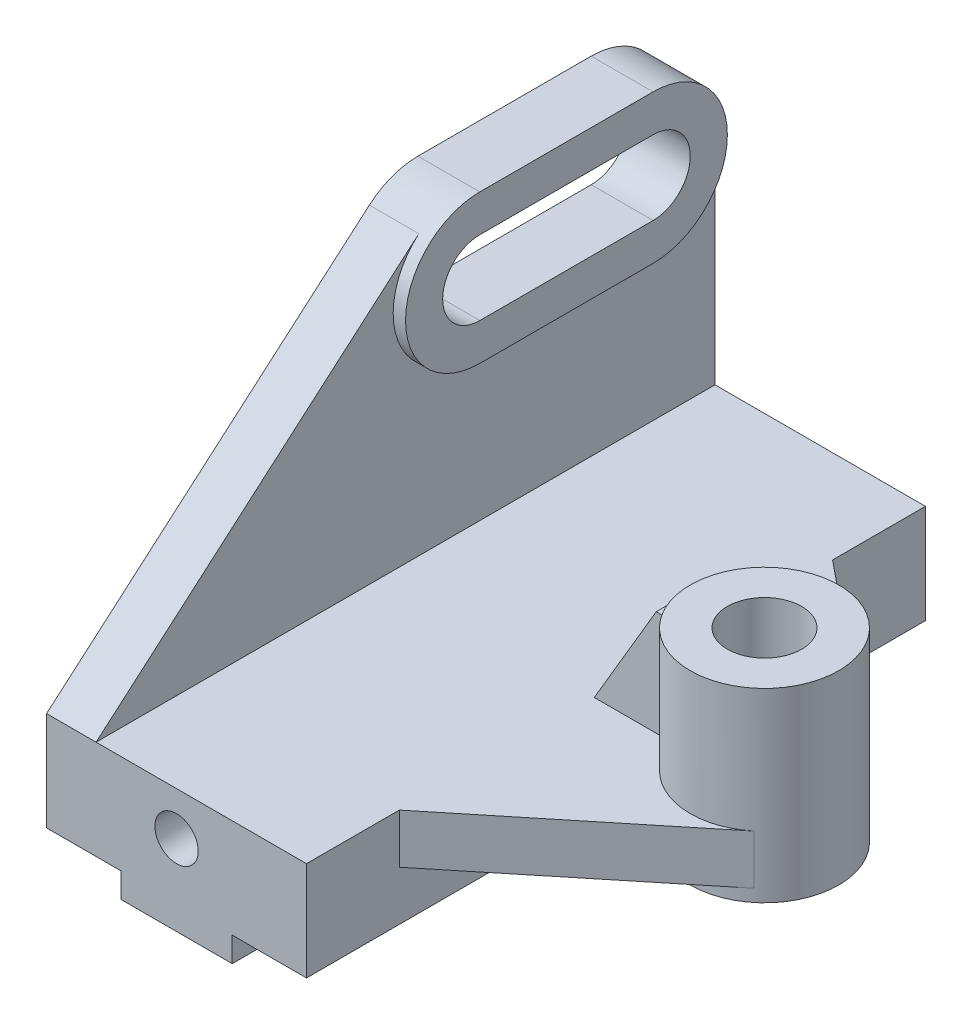
ISO-10303-21;
HEADER;
FILE_DESCRIPTION(('STEP AP214'),'2;1');
FILE_NAME('part.step','',(''),(''),'','','');
FILE_SCHEMA(('AUTOMOTIVE_DESIGN { 1 0 10303 214 1 1 1 1 }'));
ENDSEC;
DATA;
#1=APPLICATION_CONTEXT('core data for automotive mechanical design processes');
#2=APPLICATION_PROTOCOL_DEFINITION('international standard','automotive_design',2000,#1);
#3=PRODUCT_CONTEXT('',#1,'mechanical');
#4=PRODUCT('Part','Part','',(#3));
#5=PRODUCT_RELATED_PRODUCT_CATEGORY('part','',(#4));
#6=PRODUCT_DEFINITION_FORMATION('','',#4);
#7=PRODUCT_DEFINITION_CONTEXT('part definition',#1,'design');
#8=PRODUCT_DEFINITION('design','',#6,#7);
#9=PRODUCT_DEFINITION_SHAPE('','',#8);
#10=(LENGTH_UNIT() NAMED_UNIT(*) SI_UNIT(.MILLI.,.METRE.));
#11=(NAMED_UNIT(*) PLANE_ANGLE_UNIT() SI_UNIT($,.RADIAN.));
#12=(NAMED_UNIT(*) SI_UNIT($,.STERADIAN.) SOLID_ANGLE_UNIT());
#13=UNCERTAINTY_MEASURE_WITH_UNIT(LENGTH_MEASURE(1.E-05),#10,'distance_accuracy_value','');
#14=(GEOMETRIC_REPRESENTATION_CONTEXT(3) GLOBAL_UNCERTAINTY_ASSIGNED_CONTEXT((#13)) GLOBAL_UNIT_ASSIGNED_CONTEXT((#10,
#11,#12)) REPRESENTATION_CONTEXT('',''));
#15=CARTESIAN_POINT('',(0.,0.,0.));
#16=DIRECTION('',(0.,0.,1.));
#17=DIRECTION('',(1.,0.,0.));
#18=AXIS2_PLACEMENT_3D('',#15,#16,#17);
#19=CARTESIAN_POINT('',(42.,-6.,0.));
#20=DIRECTION('',(0.,1.,0.));
#21=DIRECTION('',(0.,0.,1.));
#22=AXIS2_PLACEMENT_3D('',#19,#20,#21);
#23=PLANE('',#22);
#24=DIRECTION('',(0.,0.,-1.));
#25=VECTOR('',#24,1.);
#26=CARTESIAN_POINT('',(12.,-6.,0.));
#27=LINE('',#26,#25);
#28=CARTESIAN_POINT('',(12.,-6.,50.));
#29=VERTEX_POINT('',#28);
#30=CARTESIAN_POINT('',(12.,-6.,-50.));
#31=VERTEX_POINT('',#30);
#32=EDGE_CURVE('E347',#29,#31,#27,.T.);
#33=ORIENTED_EDGE('',*,*,#32,.F.);
#34=DIRECTION('',(-1.,0.,0.));
#35=VECTOR('',#34,1.);
#36=CARTESIAN_POINT('',(42.,-6.,50.));
#37=LINE('',#36,#35);
#38=CARTESIAN_POINT('',(0.,-6.,50.));
#39=VERTEX_POINT('',#38);
#40=EDGE_CURVE('E391',#29,#39,#37,.T.);
#41=ORIENTED_EDGE('',*,*,#40,.T.);
#42=DIRECTION('',(0.,0.,-1.));
#43=VECTOR('',#42,1.);
#44=CARTESIAN_POINT('',(0.,-6.,0.));
#45=LINE('',#44,#43);
#46=CARTESIAN_POINT('',(0.,-6.,-50.));
#47=VERTEX_POINT('',#46);
#48=EDGE_CURVE('E369',#39,#47,#45,.T.);
#49=ORIENTED_EDGE('',*,*,#48,.T.);
#50=DIRECTION('',(-1.,0.,0.));
#51=VECTOR('',#50,1.);
#52=CARTESIAN_POINT('',(42.,-6.,-50.));
#53=LINE('',#52,#51);
#54=EDGE_CURVE('E380',#31,#47,#53,.T.);
#55=ORIENTED_EDGE('',*,*,#54,.F.);
#56=EDGE_LOOP('',(#33,#41,#49,#55));
#57=FACE_BOUND('',#56,.T.);
#58=ADVANCED_FACE('F43',(#57),#23,.F.);
#59=CARTESIAN_POINT('',(8.,30.460450971686,26.3286972259975));
#60=DIRECTION('',(0.,0.75655333037324,0.653931998223944));
#61=DIRECTION('',(0.,-0.653931998223944,0.75655333037324));
#62=AXIS2_PLACEMENT_3D('',#59,#60,#61);
#63=PLANE('',#62);
#64=DIRECTION('',(0.,0.653931998223944,-0.75655333037324));
#65=VECTOR('',#64,1.);
#66=CARTESIAN_POINT('',(0.,30.460450971686,26.3286972259975));
#67=LINE('',#66,#65);
#68=CARTESIAN_POINT('',(0.,10.,50.));
#69=VERTEX_POINT('',#68);
#70=CARTESIAN_POINT('',(0.,55.0786399644789,-2.15281602131265));
#71=VERTEX_POINT('',#70);
#72=EDGE_CURVE('E474',#69,#71,#67,.T.);
#73=ORIENTED_EDGE('',*,*,#72,.F.);
#74=DIRECTION('',(-1.,0.,0.));
#75=VECTOR('',#74,1.);
#76=CARTESIAN_POINT('',(8.,10.,50.));
#77=LINE('',#76,#75);
#78=CARTESIAN_POINT('',(8.00000000000001,10.,50.));
#79=VERTEX_POINT('',#78);
#80=EDGE_CURVE('E516',#79,#69,#77,.T.);
#81=ORIENTED_EDGE('',*,*,#80,.F.);
#82=DIRECTION('',(0.,0.653931998223944,-0.75655333037324));
#83=VECTOR('',#82,1.);
#84=CARTESIAN_POINT('',(8.,30.460450971686,26.3286972259975));
#85=LINE('',#84,#83);
#86=CARTESIAN_POINT('',(8.,55.0786399644789,-2.15281602131263));
#87=VERTEX_POINT('',#86);
#88=EDGE_CURVE('E495',#79,#87,#85,.T.);
#89=ORIENTED_EDGE('',*,*,#88,.T.);
#90=DIRECTION('',(-1.,0.,0.));
#91=VECTOR('',#90,1.);
#92=CARTESIAN_POINT('',(8.,55.0786399644789,-2.15281602131265));
#93=LINE('',#92,#91);
#94=EDGE_CURVE('E52',#87,#71,#93,.T.);
#95=ORIENTED_EDGE('',*,*,#94,.T.);
#96=EDGE_LOOP('',(#73,#81,#89,#95));
#97=FACE_BOUND('',#96,.T.);
#98=ADVANCED_FACE('F45',(#97),#63,.T.);
#99=CARTESIAN_POINT('',(8.,0.,-50.));
#100=DIRECTION('',(0.,0.,-1.));
#101=DIRECTION('',(0.,1.,0.));
#102=AXIS2_PLACEMENT_3D('',#99,#100,#101);
#103=PLANE('',#102);
#104=CARTESIAN_POINT('',(21.,3.,-50.));
#105=DIRECTION('',(0.,0.,1.));
#106=DIRECTION('',(1.,0.,0.));
#107=AXIS2_PLACEMENT_3D('',#104,#105,#106);
#108=CIRCLE('',#107,3.5);
#109=CARTESIAN_POINT('',(24.5,3.,-50.));
#110=VERTEX_POINT('',#109);
#111=EDGE_CURVE('E320',#110,#110,#108,.T.);
#112=ORIENTED_EDGE('',*,*,#111,.T.);
#113=EDGE_LOOP('',(#112));
#114=FACE_BOUND('',#113,.T.);
#115=DIRECTION('',(0.,-1.,0.));
#116=VECTOR('',#115,1.);
#117=CARTESIAN_POINT('',(0.,0.,-50.));
#118=LINE('',#117,#116);
#119=CARTESIAN_POINT('',(0.,46.,-50.));
#120=VERTEX_POINT('',#119);
#121=EDGE_CURVE('E489',#120,#47,#118,.T.);
#122=ORIENTED_EDGE('',*,*,#121,.F.);
#123=DIRECTION('',(-1.,0.,0.));
#124=VECTOR('',#123,1.);
#125=CARTESIAN_POINT('',(8.,46.,-50.));
#126=LINE('',#125,#124);
#127=CARTESIAN_POINT('',(8.,46.,-50.));
#128=VERTEX_POINT('',#127);
#129=EDGE_CURVE('E507',#128,#120,#126,.T.);
#130=ORIENTED_EDGE('',*,*,#129,.F.);
#131=DIRECTION('',(0.,-1.,0.));
#132=VECTOR('',#131,1.);
#133=CARTESIAN_POINT('',(8.,0.,-50.));
#134=LINE('',#133,#132);
#135=CARTESIAN_POINT('',(8.,10.,-50.));
#136=VERTEX_POINT('',#135);
#137=EDGE_CURVE('E503',#128,#136,#134,.T.);
#138=ORIENTED_EDGE('',*,*,#137,.T.);
#139=DIRECTION('',(-1.,0.,0.));
#140=VECTOR('',#139,1.);
#141=CARTESIAN_POINT('',(42.,10.,-50.));
#142=LINE('',#141,#140);
#143=CARTESIAN_POINT('',(42.,10.,-50.));
#144=VERTEX_POINT('',#143);
#145=EDGE_CURVE('E400',#144,#136,#142,.T.);
#146=ORIENTED_EDGE('',*,*,#145,.F.);
#147=DIRECTION('',(0.,-1.,0.));
#148=VECTOR('',#147,1.);
#149=CARTESIAN_POINT('',(42.,0.,-50.));
#150=LINE('',#149,#148);
#151=CARTESIAN_POINT('',(42.,-6.,-50.));
#152=VERTEX_POINT('',#151);
#153=EDGE_CURVE('E364',#144,#152,#150,.T.);
#154=ORIENTED_EDGE('',*,*,#153,.T.);
#155=CARTESIAN_POINT('',(30.,-6.,-50.));
#156=VERTEX_POINT('',#155);
#157=EDGE_CURVE('E387',#152,#156,#53,.T.);
#158=ORIENTED_EDGE('',*,*,#157,.T.);
#159=DIRECTION('',(0.,-1.,0.));
#160=VECTOR('',#159,1.);
#161=CARTESIAN_POINT('',(30.,0.,-50.));
#162=LINE('',#161,#160);
#163=CARTESIAN_POINT('',(30.,-10.,-50.));
#164=VERTEX_POINT('',#163);
#165=EDGE_CURVE('E328',#156,#164,#162,.T.);
#166=ORIENTED_EDGE('',*,*,#165,.T.);
#167=DIRECTION('',(-1.,0.,0.));
#168=VECTOR('',#167,1.);
#169=CARTESIAN_POINT('',(30.,-10.,-50.));
#170=LINE('',#169,#168);
#171=CARTESIAN_POINT('',(12.,-10.,-50.));
#172=VERTEX_POINT('',#171);
#173=EDGE_CURVE('E343',#164,#172,#170,.T.);
#174=ORIENTED_EDGE('',*,*,#173,.T.);
#175=DIRECTION('',(0.,-1.,0.));
#176=VECTOR('',#175,1.);
#177=CARTESIAN_POINT('',(12.,0.,-50.));
#178=LINE('',#177,#176);
#179=EDGE_CURVE('E324',#31,#172,#178,.T.);
#180=ORIENTED_EDGE('',*,*,#179,.F.);
#181=ORIENTED_EDGE('',*,*,#54,.T.);
#182=EDGE_LOOP('',(#122,#130,#138,#146,#154,#158,#166,#174,#180,#181));
#183=FACE_BOUND('',#182,.T.);
#184=ADVANCED_FACE('F561',(#114,#183),#103,.T.);
#185=CARTESIAN_POINT('',(8.,0.,0.));
#186=DIRECTION('',(1.,0.,0.));
#187=DIRECTION('',(0.,0.,-1.));
#188=AXIS2_PLACEMENT_3D('',#185,#186,#187);
#189=PLANE('',#188);
#190=CARTESIAN_POINT('',(8.,46.,-38.));
#191=DIRECTION('',(1.,0.,0.));
#192=DIRECTION('',(0.,0.,-1.));
#193=AXIS2_PLACEMENT_3D('',#190,#191,#192);
#194=CIRCLE('',#193,12.);
#195=CARTESIAN_POINT('',(8.,34.,-38.));
#196=VERTEX_POINT('',#195);
#197=EDGE_CURVE('E485',#196,#128,#194,.T.);
#198=ORIENTED_EDGE('',*,*,#197,.F.);
#199=DIRECTION('',(0.,0.,-1.));
#200=VECTOR('',#199,1.);
#201=CARTESIAN_POINT('',(8.,34.,0.));
#202=LINE('',#201,#200);
#203=CARTESIAN_POINT('',(8.,34.,-9.99999999999998));
#204=VERTEX_POINT('',#203);
#205=EDGE_CURVE('E488',#204,#196,#202,.T.);
#206=ORIENTED_EDGE('',*,*,#205,.F.);
#207=CARTESIAN_POINT('',(8.,46.,-9.99999999999998));
#208=DIRECTION('',(1.,0.,0.));
#209=DIRECTION('',(0.,0.,-1.));
#210=AXIS2_PLACEMENT_3D('',#207,#208,#209);
#211=CIRCLE('',#210,12.);
#212=EDGE_CURVE('E492',#87,#204,#211,.T.);
#213=ORIENTED_EDGE('',*,*,#212,.F.);
#214=ORIENTED_EDGE('',*,*,#88,.F.);
#215=DIRECTION('',(0.,0.,-1.));
#216=VECTOR('',#215,1.);
#217=CARTESIAN_POINT('',(8.,10.,0.));
#218=LINE('',#217,#216);
#219=EDGE_CURVE('E499',#79,#136,#218,.T.);
#220=ORIENTED_EDGE('',*,*,#219,.T.);
#221=ORIENTED_EDGE('',*,*,#137,.F.);
#222=EDGE_LOOP('',(#198,#206,#213,#214,#220,#221));
#223=FACE_BOUND('',#222,.T.);
#224=ADVANCED_FACE('F540',(#223),#189,.T.);
#225=CARTESIAN_POINT('',(0.,0.,0.));
#226=DIRECTION('',(1.,0.,0.));
#227=DIRECTION('',(0.,0.,-1.));
#228=AXIS2_PLACEMENT_3D('',#225,#226,#227);
#229=PLANE('',#228);
#230=CARTESIAN_POINT('',(0.,46.,-38.));
#231=DIRECTION('',(1.,0.,0.));
#232=DIRECTION('',(0.,0.,-1.));
#233=AXIS2_PLACEMENT_3D('',#230,#231,#232);
#234=CIRCLE('',#233,12.);
#235=CARTESIAN_POINT('',(0.,58.,-38.));
#236=VERTEX_POINT('',#235);
#237=EDGE_CURVE('E449',#120,#236,#234,.T.);
#238=ORIENTED_EDGE('',*,*,#237,.F.);
#239=ORIENTED_EDGE('',*,*,#121,.T.);
#240=ORIENTED_EDGE('',*,*,#48,.F.);
#241=DIRECTION('',(0.,-1.,0.));
#242=VECTOR('',#241,1.);
#243=CARTESIAN_POINT('',(0.,0.,50.));
#244=LINE('',#243,#242);
#245=EDGE_CURVE('E363',#69,#39,#244,.T.);
#246=ORIENTED_EDGE('',*,*,#245,.F.);
#247=ORIENTED_EDGE('',*,*,#72,.T.);
#248=CARTESIAN_POINT('',(0.,46.,-9.99999999999998));
#249=DIRECTION('',(1.,0.,0.));
#250=DIRECTION('',(0.,0.,-1.));
#251=AXIS2_PLACEMENT_3D('',#248,#249,#250);
#252=CIRCLE('',#251,12.);
#253=CARTESIAN_POINT('',(0.,58.,-9.99999999999998));
#254=VERTEX_POINT('',#253);
#255=EDGE_CURVE('E409',#254,#71,#252,.T.);
#256=ORIENTED_EDGE('',*,*,#255,.F.);
#257=DIRECTION('',(0.,0.,-1.));
#258=VECTOR('',#257,1.);
#259=CARTESIAN_POINT('',(0.,58.,0.));
#260=LINE('',#259,#258);
#261=EDGE_CURVE('E452',#254,#236,#260,.T.);
#262=ORIENTED_EDGE('',*,*,#261,.T.);
#263=EDGE_LOOP('',(#238,#239,#240,#246,#247,#256,#262));
#264=FACE_BOUND('',#263,.T.);
#265=CARTESIAN_POINT('',(0.,46.,-38.));
#266=DIRECTION('',(1.,0.,0.));
#267=DIRECTION('',(0.,0.,-1.));
#268=AXIS2_PLACEMENT_3D('',#265,#266,#267);
#269=CIRCLE('',#268,6.);
#270=CARTESIAN_POINT('',(0.,40.,-38.));
#271=VERTEX_POINT('',#270);
#272=CARTESIAN_POINT('',(0.,52.,-38.));
#273=VERTEX_POINT('',#272);
#274=EDGE_CURVE('E403',#271,#273,#269,.T.);
#275=ORIENTED_EDGE('',*,*,#274,.T.);
#276=DIRECTION('',(0.,0.,-1.));
#277=VECTOR('',#276,1.);
#278=CARTESIAN_POINT('',(0.,52.,0.));
#279=LINE('',#278,#277);
#280=CARTESIAN_POINT('',(0.,52.,-9.99999999999998));
#281=VERTEX_POINT('',#280);
#282=EDGE_CURVE('E445',#281,#273,#279,.T.);
#283=ORIENTED_EDGE('',*,*,#282,.F.);
#284=CARTESIAN_POINT('',(0.,46.,-9.99999999999998));
#285=DIRECTION('',(1.,0.,0.));
#286=DIRECTION('',(0.,0.,-1.));
#287=AXIS2_PLACEMENT_3D('',#284,#285,#286);
#288=CIRCLE('',#287,6.);
#289=CARTESIAN_POINT('',(0.,40.,-9.99999999999998));
#290=VERTEX_POINT('',#289);
#291=EDGE_CURVE('E441',#281,#290,#288,.T.);
#292=ORIENTED_EDGE('',*,*,#291,.T.);
#293=DIRECTION('',(0.,0.,-1.));
#294=VECTOR('',#293,1.);
#295=CARTESIAN_POINT('',(0.,40.,0.));
#296=LINE('',#295,#294);
#297=EDGE_CURVE('E437',#290,#271,#296,.T.);
#298=ORIENTED_EDGE('',*,*,#297,.T.);
#299=EDGE_LOOP('',(#275,#283,#292,#298));
#300=FACE_BOUND('',#299,.T.);
#301=ADVANCED_FACE('F530',(#264,#300),#229,.F.);
#302=CARTESIAN_POINT('',(10.,46.,-9.99999999999998));
#303=DIRECTION('',(-1.,0.,0.));
#304=DIRECTION('',(0.,0.,1.));
#305=AXIS2_PLACEMENT_3D('',#302,#303,#304);
#306=CYLINDRICAL_SURFACE('',#305,12.);
#307=ORIENTED_EDGE('',*,*,#255,.T.);
#308=ORIENTED_EDGE('',*,*,#94,.F.);
#309=ORIENTED_EDGE('',*,*,#212,.T.);
#310=DIRECTION('',(-1.,0.,0.));
#311=VECTOR('',#310,1.);
#312=CARTESIAN_POINT('',(10.,34.,-9.99999999999998));
#313=LINE('',#312,#311);
#314=CARTESIAN_POINT('',(10.,34.,-9.99999999999998));
#315=VERTEX_POINT('',#314);
#316=EDGE_CURVE('E462',#315,#204,#313,.T.);
#317=ORIENTED_EDGE('',*,*,#316,.F.);
#318=CARTESIAN_POINT('',(10.,46.,-9.99999999999998));
#319=DIRECTION('',(1.,0.,0.));
#320=DIRECTION('',(0.,0.,-1.));
#321=AXIS2_PLACEMENT_3D('',#318,#319,#320);
#322=CIRCLE('',#321,12.);
#323=CARTESIAN_POINT('',(10.,58.,-9.99999999999998));
#324=VERTEX_POINT('',#323);
#325=EDGE_CURVE('E427',#324,#315,#322,.T.);
#326=ORIENTED_EDGE('',*,*,#325,.F.);
#327=DIRECTION('',(-1.,0.,0.));
#328=VECTOR('',#327,1.);
#329=CARTESIAN_POINT('',(10.,58.,-9.99999999999998));
#330=LINE('',#329,#328);
#331=EDGE_CURVE('E467',#324,#254,#330,.T.);
#332=ORIENTED_EDGE('',*,*,#331,.T.);
#333=EDGE_LOOP('',(#307,#308,#309,#317,#326,#332));
#334=FACE_BOUND('',#333,.T.);
#335=ADVANCED_FACE('F544',(#334),#306,.T.);
#336=CARTESIAN_POINT('',(10.,46.,-38.));
#337=DIRECTION('',(-1.,0.,0.));
#338=DIRECTION('',(0.,0.,1.));
#339=AXIS2_PLACEMENT_3D('',#336,#337,#338);
#340=CYLINDRICAL_SURFACE('',#339,12.);
#341=ORIENTED_EDGE('',*,*,#129,.T.);
#342=ORIENTED_EDGE('',*,*,#237,.T.);
#343=DIRECTION('',(-1.,0.,0.));
#344=VECTOR('',#343,1.);
#345=CARTESIAN_POINT('',(10.,58.,-38.));
#346=LINE('',#345,#344);
#347=CARTESIAN_POINT('',(10.,58.,-38.));
#348=VERTEX_POINT('',#347);
#349=EDGE_CURVE('E470',#348,#236,#346,.T.);
#350=ORIENTED_EDGE('',*,*,#349,.F.);
#351=CARTESIAN_POINT('',(10.,46.,-38.));
#352=DIRECTION('',(1.,0.,0.));
#353=DIRECTION('',(0.,0.,-1.));
#354=AXIS2_PLACEMENT_3D('',#351,#352,#353);
#355=CIRCLE('',#354,12.);
#356=CARTESIAN_POINT('',(10.,34.,-38.));
#357=VERTEX_POINT('',#356);
#358=EDGE_CURVE('E420',#357,#348,#355,.T.);
#359=ORIENTED_EDGE('',*,*,#358,.F.);
#360=DIRECTION('',(-1.,0.,0.));
#361=VECTOR('',#360,1.);
#362=CARTESIAN_POINT('',(10.,34.,-38.));
#363=LINE('',#362,#361);
#364=EDGE_CURVE('E458',#357,#196,#363,.T.);
#365=ORIENTED_EDGE('',*,*,#364,.T.);
#366=ORIENTED_EDGE('',*,*,#197,.T.);
#367=EDGE_LOOP('',(#341,#342,#350,#359,#365,#366));
#368=FACE_BOUND('',#367,.T.);
#369=ADVANCED_FACE('F624',(#368),#340,.T.);
#370=CARTESIAN_POINT('',(10.,58.,0.));
#371=DIRECTION('',(0.,1.,0.));
#372=DIRECTION('',(0.,0.,1.));
#373=AXIS2_PLACEMENT_3D('',#370,#371,#372);
#374=PLANE('',#373);
#375=ORIENTED_EDGE('',*,*,#261,.F.);
#376=ORIENTED_EDGE('',*,*,#331,.F.);
#377=DIRECTION('',(0.,0.,-1.));
#378=VECTOR('',#377,1.);
#379=CARTESIAN_POINT('',(10.,58.,0.));
#380=LINE('',#379,#378);
#381=EDGE_CURVE('E423',#324,#348,#380,.T.);
#382=ORIENTED_EDGE('',*,*,#381,.T.);
#383=ORIENTED_EDGE('',*,*,#349,.T.);
#384=EDGE_LOOP('',(#375,#376,#382,#383));
#385=FACE_BOUND('',#384,.T.);
#386=ADVANCED_FACE('F556',(#385),#374,.T.);
#387=CARTESIAN_POINT('',(10.,46.,-38.));
#388=DIRECTION('',(-1.,0.,0.));
#389=DIRECTION('',(0.,0.,1.));
#390=AXIS2_PLACEMENT_3D('',#387,#388,#389);
#391=CYLINDRICAL_SURFACE('',#390,6.);
#392=ORIENTED_EDGE('',*,*,#274,.F.);
#393=DIRECTION('',(-1.,0.,0.));
#394=VECTOR('',#393,1.);
#395=CARTESIAN_POINT('',(10.,40.,-38.));
#396=LINE('',#395,#394);
#397=CARTESIAN_POINT('',(10.,40.,-38.));
#398=VERTEX_POINT('',#397);
#399=EDGE_CURVE('E463',#398,#271,#396,.T.);
#400=ORIENTED_EDGE('',*,*,#399,.F.);
#401=CARTESIAN_POINT('',(10.,46.,-38.));
#402=DIRECTION('',(1.,0.,0.));
#403=DIRECTION('',(0.,0.,-1.));
#404=AXIS2_PLACEMENT_3D('',#401,#402,#403);
#405=CIRCLE('',#404,6.);
#406=CARTESIAN_POINT('',(10.,52.,-38.));
#407=VERTEX_POINT('',#406);
#408=EDGE_CURVE('E404',#398,#407,#405,.T.);
#409=ORIENTED_EDGE('',*,*,#408,.T.);
#410=DIRECTION('',(-1.,0.,0.));
#411=VECTOR('',#410,1.);
#412=CARTESIAN_POINT('',(10.,52.,-38.));
#413=LINE('',#412,#411);
#414=EDGE_CURVE('E433',#407,#273,#413,.T.);
#415=ORIENTED_EDGE('',*,*,#414,.T.);
#416=EDGE_LOOP('',(#392,#400,#409,#415));
#417=FACE_BOUND('',#416,.T.);
#418=ADVANCED_FACE('F631',(#417),#391,.F.);
#419=CARTESIAN_POINT('',(10.,40.,0.));
#420=DIRECTION('',(0.,1.,0.));
#421=DIRECTION('',(0.,0.,1.));
#422=AXIS2_PLACEMENT_3D('',#419,#420,#421);
#423=PLANE('',#422);
#424=ORIENTED_EDGE('',*,*,#297,.F.);
#425=DIRECTION('',(-1.,0.,0.));
#426=VECTOR('',#425,1.);
#427=CARTESIAN_POINT('',(10.,40.,-9.99999999999998));
#428=LINE('',#427,#426);
#429=CARTESIAN_POINT('',(10.,40.,-9.99999999999998));
#430=VERTEX_POINT('',#429);
#431=EDGE_CURVE('E480',#430,#290,#428,.T.);
#432=ORIENTED_EDGE('',*,*,#431,.F.);
#433=DIRECTION('',(0.,0.,-1.));
#434=VECTOR('',#433,1.);
#435=CARTESIAN_POINT('',(10.,40.,0.));
#436=LINE('',#435,#434);
#437=EDGE_CURVE('E408',#430,#398,#436,.T.);
#438=ORIENTED_EDGE('',*,*,#437,.T.);
#439=ORIENTED_EDGE('',*,*,#399,.T.);
#440=EDGE_LOOP('',(#424,#432,#438,#439));
#441=FACE_BOUND('',#440,.T.);
#442=ADVANCED_FACE('F642',(#441),#423,.T.);
#443=CARTESIAN_POINT('',(10.,46.,-9.99999999999998));
#444=DIRECTION('',(-1.,0.,0.));
#445=DIRECTION('',(0.,0.,1.));
#446=AXIS2_PLACEMENT_3D('',#443,#444,#445);
#447=CYLINDRICAL_SURFACE('',#446,6.);
#448=ORIENTED_EDGE('',*,*,#291,.F.);
#449=DIRECTION('',(-1.,0.,0.));
#450=VECTOR('',#449,1.);
#451=CARTESIAN_POINT('',(10.,52.,-9.99999999999998));
#452=LINE('',#451,#450);
#453=CARTESIAN_POINT('',(10.,52.,-9.99999999999998));
#454=VERTEX_POINT('',#453);
#455=EDGE_CURVE('E477',#454,#281,#452,.T.);
#456=ORIENTED_EDGE('',*,*,#455,.F.);
#457=CARTESIAN_POINT('',(10.,46.,-9.99999999999998));
#458=DIRECTION('',(1.,0.,0.));
#459=DIRECTION('',(0.,0.,-1.));
#460=AXIS2_PLACEMENT_3D('',#457,#458,#459);
#461=CIRCLE('',#460,6.);
#462=EDGE_CURVE('E413',#454,#430,#461,.T.);
#463=ORIENTED_EDGE('',*,*,#462,.T.);
#464=ORIENTED_EDGE('',*,*,#431,.T.);
#465=EDGE_LOOP('',(#448,#456,#463,#464));
#466=FACE_BOUND('',#465,.T.);
#467=ADVANCED_FACE('F638',(#466),#447,.F.);
#468=CARTESIAN_POINT('',(10.,52.,0.));
#469=DIRECTION('',(0.,1.,0.));
#470=DIRECTION('',(0.,0.,1.));
#471=AXIS2_PLACEMENT_3D('',#468,#469,#470);
#472=PLANE('',#471);
#473=ORIENTED_EDGE('',*,*,#282,.T.);
#474=ORIENTED_EDGE('',*,*,#414,.F.);
#475=DIRECTION('',(0.,0.,-1.));
#476=VECTOR('',#475,1.);
#477=CARTESIAN_POINT('',(10.,52.,0.));
#478=LINE('',#477,#476);
#479=EDGE_CURVE('E417',#454,#407,#478,.T.);
#480=ORIENTED_EDGE('',*,*,#479,.F.);
#481=ORIENTED_EDGE('',*,*,#455,.T.);
#482=EDGE_LOOP('',(#473,#474,#480,#481));
#483=FACE_BOUND('',#482,.T.);
#484=ADVANCED_FACE('F635',(#483),#472,.F.);
#485=CARTESIAN_POINT('',(10.,34.,0.));
#486=DIRECTION('',(0.,1.,0.));
#487=DIRECTION('',(0.,0.,1.));
#488=AXIS2_PLACEMENT_3D('',#485,#486,#487);
#489=PLANE('',#488);
#490=ORIENTED_EDGE('',*,*,#205,.T.);
#491=ORIENTED_EDGE('',*,*,#364,.F.);
#492=DIRECTION('',(0.,0.,-1.));
#493=VECTOR('',#492,1.);
#494=CARTESIAN_POINT('',(10.,34.,0.));
#495=LINE('',#494,#493);
#496=EDGE_CURVE('E430',#315,#357,#495,.T.);
#497=ORIENTED_EDGE('',*,*,#496,.F.);
#498=ORIENTED_EDGE('',*,*,#316,.T.);
#499=EDGE_LOOP('',(#490,#491,#497,#498));
#500=FACE_BOUND('',#499,.T.);
#501=ADVANCED_FACE('F548',(#500),#489,.F.);
#502=CARTESIAN_POINT('',(10.,0.,0.));
#503=DIRECTION('',(1.,0.,0.));
#504=DIRECTION('',(0.,0.,-1.));
#505=AXIS2_PLACEMENT_3D('',#502,#503,#504);
#506=PLANE('',#505);
#507=ORIENTED_EDGE('',*,*,#408,.F.);
#508=ORIENTED_EDGE('',*,*,#437,.F.);
#509=ORIENTED_EDGE('',*,*,#462,.F.);
#510=ORIENTED_EDGE('',*,*,#479,.T.);
#511=EDGE_LOOP('',(#507,#508,#509,#510));
#512=FACE_BOUND('',#511,.T.);
#513=ORIENTED_EDGE('',*,*,#358,.T.);
#514=ORIENTED_EDGE('',*,*,#381,.F.);
#515=ORIENTED_EDGE('',*,*,#325,.T.);
#516=ORIENTED_EDGE('',*,*,#496,.T.);
#517=EDGE_LOOP('',(#513,#514,#515,#516));
#518=FACE_BOUND('',#517,.T.);
#519=ADVANCED_FACE('F552',(#512,#518),#506,.T.);
#520=CARTESIAN_POINT('',(42.,10.,0.));
#521=DIRECTION('',(0.,1.,0.));
#522=DIRECTION('',(0.,0.,1.));
#523=AXIS2_PLACEMENT_3D('',#520,#521,#522);
#524=PLANE('',#523);
#525=DIRECTION('',(1.,0.,0.));
#526=VECTOR('',#525,1.);
#527=CARTESIAN_POINT('',(42.,10.,3.5));
#528=LINE('',#527,#526);
#529=CARTESIAN_POINT('',(42.,10.,3.5));
#530=VERTEX_POINT('',#529);
#531=CARTESIAN_POINT('',(54.521759716751,10.,3.5));
#532=VERTEX_POINT('',#531);
#533=EDGE_CURVE('E260',#530,#532,#528,.T.);
#534=ORIENTED_EDGE('',*,*,#533,.F.);
#535=DIRECTION('',(0.,0.,-1.));
#536=VECTOR('',#535,1.);
#537=CARTESIAN_POINT('',(42.,10.,0.));
#538=LINE('',#537,#536);
#539=CARTESIAN_POINT('',(42.,10.,-3.5));
#540=VERTEX_POINT('',#539);
#541=EDGE_CURVE('E226',#540,#530,#538,.F.);
#542=ORIENTED_EDGE('',*,*,#541,.F.);
#543=DIRECTION('',(1.,0.,0.));
#544=VECTOR('',#543,1.);
#545=CARTESIAN_POINT('',(42.,10.,-3.5));
#546=LINE('',#545,#544);
#547=CARTESIAN_POINT('',(54.521759716751,10.,-3.5));
#548=VERTEX_POINT('',#547);
#549=EDGE_CURVE('E254',#540,#548,#546,.T.);
#550=ORIENTED_EDGE('',*,*,#549,.T.);
#551=CARTESIAN_POINT('',(66.,10.,0.));
#552=DIRECTION('',(0.,1.,0.));
#553=DIRECTION('',(0.,0.,1.));
#554=AXIS2_PLACEMENT_3D('',#551,#552,#553);
#555=CIRCLE('',#554,12.);
#556=CARTESIAN_POINT('',(73.5739207368795,10.,-9.30783136243166));
#557=VERTEX_POINT('',#556);
#558=EDGE_CURVE('E300',#557,#548,#555,.T.);
#559=ORIENTED_EDGE('',*,*,#558,.F.);
#560=DIRECTION('',(0.775652613535973,0.,0.631160061406626));
#561=VECTOR('',#560,1.);
#562=CARTESIAN_POINT('',(33.8658802624573,10.,-41.6188541409436));
#563=LINE('',#562,#561);
#564=CARTESIAN_POINT('',(42.,10.,-35.));
#565=VERTEX_POINT('',#564);
#566=EDGE_CURVE('E285',#565,#557,#563,.T.);
#567=ORIENTED_EDGE('',*,*,#566,.F.);
#568=DIRECTION('',(0.,0.,-1.));
#569=VECTOR('',#568,1.);
#570=CARTESIAN_POINT('',(42.,10.,0.));
#571=LINE('',#570,#569);
#572=EDGE_CURVE('E368',#565,#144,#571,.T.);
#573=ORIENTED_EDGE('',*,*,#572,.T.);
#574=ORIENTED_EDGE('',*,*,#145,.T.);
#575=ORIENTED_EDGE('',*,*,#219,.F.);
#576=DIRECTION('',(-1.,0.,0.));
#577=VECTOR('',#576,1.);
#578=CARTESIAN_POINT('',(42.,10.,50.));
#579=LINE('',#578,#577);
#580=CARTESIAN_POINT('',(42.,10.,50.));
#581=VERTEX_POINT('',#580);
#582=EDGE_CURVE('E396',#581,#79,#579,.T.);
#583=ORIENTED_EDGE('',*,*,#582,.F.);
#584=CARTESIAN_POINT('',(42.,10.,35.));
#585=VERTEX_POINT('',#584);
#586=EDGE_CURVE('E370',#581,#585,#571,.T.);
#587=ORIENTED_EDGE('',*,*,#586,.T.);
#588=DIRECTION('',(0.775652613535972,0.,-0.631160061406626));
#589=VECTOR('',#588,1.);
#590=CARTESIAN_POINT('',(33.8658802624574,10.,41.6188541409436));
#591=LINE('',#590,#589);
#592=CARTESIAN_POINT('',(73.5739207368795,10.,9.30783136243166));
#593=VERTEX_POINT('',#592);
#594=EDGE_CURVE('E66',#585,#593,#591,.T.);
#595=ORIENTED_EDGE('',*,*,#594,.T.);
#596=EDGE_CURVE('E299',#532,#593,#555,.T.);
#597=ORIENTED_EDGE('',*,*,#596,.F.);
#598=EDGE_LOOP('',(#534,#542,#550,#559,#567,#573,#574,#575,#583,#587,#595,#597));
#599=FACE_BOUND('',#598,.T.);
#600=ADVANCED_FACE('F577',(#599),#524,.T.);
#601=CARTESIAN_POINT('',(42.,0.,50.));
#602=DIRECTION('',(0.,0.,-1.));
#603=DIRECTION('',(-1.,0.,0.));
#604=AXIS2_PLACEMENT_3D('',#601,#602,#603);
#605=PLANE('',#604);
#606=CARTESIAN_POINT('',(21.,3.,50.));
#607=DIRECTION('',(0.,0.,1.));
#608=DIRECTION('',(1.,0.,0.));
#609=AXIS2_PLACEMENT_3D('',#606,#607,#608);
#610=CIRCLE('',#609,3.5);
#611=CARTESIAN_POINT('',(24.5,3.,50.));
#612=VERTEX_POINT('',#611);
#613=EDGE_CURVE('E311',#612,#612,#610,.T.);
#614=ORIENTED_EDGE('',*,*,#613,.F.);
#615=EDGE_LOOP('',(#614));
#616=FACE_BOUND('',#615,.T.);
#617=ORIENTED_EDGE('',*,*,#245,.T.);
#618=ORIENTED_EDGE('',*,*,#40,.F.);
#619=DIRECTION('',(0.,-1.,0.));
#620=VECTOR('',#619,1.);
#621=CARTESIAN_POINT('',(12.,0.,50.));
#622=LINE('',#621,#620);
#623=CARTESIAN_POINT('',(12.,-10.,50.));
#624=VERTEX_POINT('',#623);
#625=EDGE_CURVE('E351',#29,#624,#622,.T.);
#626=ORIENTED_EDGE('',*,*,#625,.T.);
#627=DIRECTION('',(-1.,0.,0.));
#628=VECTOR('',#627,1.);
#629=CARTESIAN_POINT('',(30.,-10.,50.));
#630=LINE('',#629,#628);
#631=CARTESIAN_POINT('',(30.,-10.,50.));
#632=VERTEX_POINT('',#631);
#633=EDGE_CURVE('E359',#632,#624,#630,.T.);
#634=ORIENTED_EDGE('',*,*,#633,.F.);
#635=DIRECTION('',(0.,-1.,0.));
#636=VECTOR('',#635,1.);
#637=CARTESIAN_POINT('',(30.,0.,50.));
#638=LINE('',#637,#636);
#639=CARTESIAN_POINT('',(30.,-6.,50.));
#640=VERTEX_POINT('',#639);
#641=EDGE_CURVE('E337',#640,#632,#638,.T.);
#642=ORIENTED_EDGE('',*,*,#641,.F.);
#643=CARTESIAN_POINT('',(42.,-6.,50.));
#644=VERTEX_POINT('',#643);
#645=EDGE_CURVE('E392',#644,#640,#37,.T.);
#646=ORIENTED_EDGE('',*,*,#645,.F.);
#647=DIRECTION('',(0.,-1.,0.));
#648=VECTOR('',#647,1.);
#649=CARTESIAN_POINT('',(42.,0.,50.));
#650=LINE('',#649,#648);
#651=EDGE_CURVE('E374',#581,#644,#650,.T.);
#652=ORIENTED_EDGE('',*,*,#651,.F.);
#653=ORIENTED_EDGE('',*,*,#582,.T.);
#654=ORIENTED_EDGE('',*,*,#80,.T.);
#655=EDGE_LOOP('',(#617,#618,#626,#634,#642,#646,#652,#653,#654));
#656=FACE_BOUND('',#655,.T.);
#657=ADVANCED_FACE('F536',(#616,#656),#605,.F.);
#658=ORIENTED_EDGE('',*,*,#157,.F.);
#659=DIRECTION('',(0.,0.,-1.));
#660=VECTOR('',#659,1.);
#661=CARTESIAN_POINT('',(42.,-6.,0.));
#662=LINE('',#661,#660);
#663=EDGE_CURVE('E377',#644,#152,#662,.T.);
#664=ORIENTED_EDGE('',*,*,#663,.F.);
#665=ORIENTED_EDGE('',*,*,#645,.T.);
#666=DIRECTION('',(0.,0.,-1.));
#667=VECTOR('',#666,1.);
#668=CARTESIAN_POINT('',(30.,-6.,0.));
#669=LINE('',#668,#667);
#670=EDGE_CURVE('E332',#640,#156,#669,.T.);
#671=ORIENTED_EDGE('',*,*,#670,.T.);
#672=EDGE_LOOP('',(#658,#664,#665,#671));
#673=FACE_BOUND('',#672,.T.);
#674=ADVANCED_FACE('F605',(#673),#23,.F.);
#675=CARTESIAN_POINT('',(42.,0.,0.));
#676=DIRECTION('',(1.,0.,0.));
#677=DIRECTION('',(0.,0.,-1.));
#678=AXIS2_PLACEMENT_3D('',#675,#676,#677);
#679=PLANE('',#678);
#680=ORIENTED_EDGE('',*,*,#663,.T.);
#681=ORIENTED_EDGE('',*,*,#153,.F.);
#682=ORIENTED_EDGE('',*,*,#572,.F.);
#683=DIRECTION('',(0.,1.,0.));
#684=VECTOR('',#683,1.);
#685=CARTESIAN_POINT('',(42.,2.,-35.));
#686=LINE('',#685,#684);
#687=CARTESIAN_POINT('',(42.,2.,-35.));
#688=VERTEX_POINT('',#687);
#689=EDGE_CURVE('E307',#688,#565,#686,.T.);
#690=ORIENTED_EDGE('',*,*,#689,.F.);
#691=DIRECTION('',(0.,0.,-1.));
#692=VECTOR('',#691,1.);
#693=CARTESIAN_POINT('',(42.,2.,0.));
#694=LINE('',#693,#692);
#695=CARTESIAN_POINT('',(42.,2.,35.));
#696=VERTEX_POINT('',#695);
#697=EDGE_CURVE('E281',#696,#688,#694,.T.);
#698=ORIENTED_EDGE('',*,*,#697,.F.);
#699=DIRECTION('',(0.,1.,0.));
#700=VECTOR('',#699,1.);
#701=CARTESIAN_POINT('',(42.,2.,35.));
#702=LINE('',#701,#700);
#703=EDGE_CURVE('E296',#696,#585,#702,.T.);
#704=ORIENTED_EDGE('',*,*,#703,.T.);
#705=ORIENTED_EDGE('',*,*,#586,.F.);
#706=ORIENTED_EDGE('',*,*,#651,.T.);
#707=EDGE_LOOP('',(#680,#681,#682,#690,#698,#704,#705,#706));
#708=FACE_BOUND('',#707,.T.);
#709=ADVANCED_FACE('F580',(#708),#679,.T.);
#710=CARTESIAN_POINT('',(30.,-10.,0.));
#711=DIRECTION('',(0.,1.,0.));
#712=DIRECTION('',(0.,0.,1.));
#713=AXIS2_PLACEMENT_3D('',#710,#711,#712);
#714=PLANE('',#713);
#715=DIRECTION('',(0.,0.,-1.));
#716=VECTOR('',#715,1.);
#717=CARTESIAN_POINT('',(12.,-10.,0.));
#718=LINE('',#717,#716);
#719=EDGE_CURVE('E333',#624,#172,#718,.T.);
#720=ORIENTED_EDGE('',*,*,#719,.T.);
#721=ORIENTED_EDGE('',*,*,#173,.F.);
#722=DIRECTION('',(0.,0.,-1.));
#723=VECTOR('',#722,1.);
#724=CARTESIAN_POINT('',(30.,-10.,0.));
#725=LINE('',#724,#723);
#726=EDGE_CURVE('E340',#632,#164,#725,.T.);
#727=ORIENTED_EDGE('',*,*,#726,.F.);
#728=ORIENTED_EDGE('',*,*,#633,.T.);
#729=EDGE_LOOP('',(#720,#721,#727,#728));
#730=FACE_BOUND('',#729,.T.);
#731=ADVANCED_FACE('F617',(#730),#714,.F.);
#732=CARTESIAN_POINT('',(30.,0.,0.));
#733=DIRECTION('',(1.,0.,0.));
#734=DIRECTION('',(0.,0.,-1.));
#735=AXIS2_PLACEMENT_3D('',#732,#733,#734);
#736=PLANE('',#735);
#737=ORIENTED_EDGE('',*,*,#165,.F.);
#738=ORIENTED_EDGE('',*,*,#670,.F.);
#739=ORIENTED_EDGE('',*,*,#641,.T.);
#740=ORIENTED_EDGE('',*,*,#726,.T.);
#741=EDGE_LOOP('',(#737,#738,#739,#740));
#742=FACE_BOUND('',#741,.T.);
#743=ADVANCED_FACE('F670',(#742),#736,.T.);
#744=CARTESIAN_POINT('',(12.,0.,0.));
#745=DIRECTION('',(1.,0.,0.));
#746=DIRECTION('',(0.,0.,-1.));
#747=AXIS2_PLACEMENT_3D('',#744,#745,#746);
#748=PLANE('',#747);
#749=ORIENTED_EDGE('',*,*,#179,.T.);
#750=ORIENTED_EDGE('',*,*,#719,.F.);
#751=ORIENTED_EDGE('',*,*,#625,.F.);
#752=ORIENTED_EDGE('',*,*,#32,.T.);
#753=EDGE_LOOP('',(#749,#750,#751,#752));
#754=FACE_BOUND('',#753,.T.);
#755=ADVANCED_FACE('F662',(#754),#748,.F.);
#756=CARTESIAN_POINT('',(21.,3.,-50.));
#757=DIRECTION('',(0.,0.,1.));
#758=DIRECTION('',(1.,0.,0.));
#759=AXIS2_PLACEMENT_3D('',#756,#757,#758);
#760=CYLINDRICAL_SURFACE('',#759,3.5);
#761=ORIENTED_EDGE('',*,*,#111,.F.);
#762=EDGE_LOOP('',(#761));
#763=FACE_BOUND('',#762,.T.);
#764=ORIENTED_EDGE('',*,*,#613,.T.);
#765=EDGE_LOOP('',(#764));
#766=FACE_BOUND('',#765,.T.);
#767=ADVANCED_FACE('F659',(#763,#766),#760,.F.);
#768=CARTESIAN_POINT('',(33.8658802624573,2.,-41.6188541409436));
#769=DIRECTION('',(-0.631160061406626,0.,0.775652613535973));
#770=DIRECTION('',(0.775652613535973,0.,0.631160061406626));
#771=AXIS2_PLACEMENT_3D('',#768,#769,#770);
#772=PLANE('',#771);
#773=ORIENTED_EDGE('',*,*,#566,.T.);
#774=DIRECTION('',(0.,1.,0.));
#775=VECTOR('',#774,1.);
#776=CARTESIAN_POINT('',(73.5739207368795,2.,-9.30783136243166));
#777=LINE('',#776,#775);
#778=CARTESIAN_POINT('',(73.5739207368795,2.,-9.30783136243167));
#779=VERTEX_POINT('',#778);
#780=EDGE_CURVE('E312',#779,#557,#777,.T.);
#781=ORIENTED_EDGE('',*,*,#780,.F.);
#782=DIRECTION('',(0.775652613535973,0.,0.631160061406626));
#783=VECTOR('',#782,1.);
#784=CARTESIAN_POINT('',(33.8658802624573,2.,-41.6188541409436));
#785=LINE('',#784,#783);
#786=EDGE_CURVE('E292',#688,#779,#785,.T.);
#787=ORIENTED_EDGE('',*,*,#786,.F.);
#788=ORIENTED_EDGE('',*,*,#689,.T.);
#789=EDGE_LOOP('',(#773,#781,#787,#788));
#790=FACE_BOUND('',#789,.T.);
#791=ADVANCED_FACE('F590',(#790),#772,.F.);
#792=CARTESIAN_POINT('',(33.8658802624574,2.,41.6188541409436));
#793=DIRECTION('',(0.631160061406626,0.,0.775652613535972));
#794=DIRECTION('',(0.775652613535972,0.,-0.631160061406626));
#795=AXIS2_PLACEMENT_3D('',#792,#793,#794);
#796=PLANE('',#795);
#797=ORIENTED_EDGE('',*,*,#594,.F.);
#798=ORIENTED_EDGE('',*,*,#703,.F.);
#799=DIRECTION('',(0.775652613535972,0.,-0.631160061406626));
#800=VECTOR('',#799,1.);
#801=CARTESIAN_POINT('',(33.8658802624574,2.,41.6188541409436));
#802=LINE('',#801,#800);
#803=CARTESIAN_POINT('',(73.5739207368795,2.,9.30783136243167));
#804=VERTEX_POINT('',#803);
#805=EDGE_CURVE('E284',#696,#804,#802,.T.);
#806=ORIENTED_EDGE('',*,*,#805,.T.);
#807=DIRECTION('',(0.,1.,0.));
#808=VECTOR('',#807,1.);
#809=CARTESIAN_POINT('',(73.5739207368795,2.,9.30783136243167));
#810=LINE('',#809,#808);
#811=EDGE_CURVE('E315',#804,#593,#810,.T.);
#812=ORIENTED_EDGE('',*,*,#811,.T.);
#813=EDGE_LOOP('',(#797,#798,#806,#812));
#814=FACE_BOUND('',#813,.T.);
#815=ADVANCED_FACE('F575',(#814),#796,.T.);
#816=CARTESIAN_POINT('',(0.,2.,0.));
#817=DIRECTION('',(0.,1.,0.));
#818=DIRECTION('',(0.,0.,1.));
#819=AXIS2_PLACEMENT_3D('',#816,#817,#818);
#820=PLANE('',#819);
#821=ORIENTED_EDGE('',*,*,#697,.T.);
#822=ORIENTED_EDGE('',*,*,#786,.T.);
#823=CARTESIAN_POINT('',(66.,2.,0.));
#824=DIRECTION('',(0.,1.,0.));
#825=DIRECTION('',(0.,0.,1.));
#826=AXIS2_PLACEMENT_3D('',#823,#824,#825);
#827=CIRCLE('',#826,12.);
#828=EDGE_CURVE('E289',#779,#804,#827,.T.);
#829=ORIENTED_EDGE('',*,*,#828,.T.);
#830=ORIENTED_EDGE('',*,*,#805,.F.);
#831=EDGE_LOOP('',(#821,#822,#829,#830));
#832=FACE_BOUND('',#831,.T.);
#833=ADVANCED_FACE('F585',(#832),#820,.F.);
#834=CARTESIAN_POINT('',(66.,0.,0.));
#835=DIRECTION('',(0.,1.,0.));
#836=DIRECTION('',(0.,0.,1.));
#837=AXIS2_PLACEMENT_3D('',#834,#835,#836);
#838=CYLINDRICAL_SURFACE('',#837,6.);
#839=CARTESIAN_POINT('',(66.,0.,0.));
#840=DIRECTION('',(0.,1.,0.));
#841=DIRECTION('',(0.,0.,1.));
#842=AXIS2_PLACEMENT_3D('',#839,#840,#841);
#843=CIRCLE('',#842,6.);
#844=CARTESIAN_POINT('',(66.,0.,6.));
#845=VERTEX_POINT('',#844);
#846=EDGE_CURVE('E273',#845,#845,#843,.T.);
#847=ORIENTED_EDGE('',*,*,#846,.F.);
#848=EDGE_LOOP('',(#847));
#849=FACE_BOUND('',#848,.T.);
#850=CARTESIAN_POINT('',(66.,30.,0.));
#851=DIRECTION('',(0.,1.,0.));
#852=DIRECTION('',(0.,0.,1.));
#853=AXIS2_PLACEMENT_3D('',#850,#851,#852);
#854=CIRCLE('',#853,6.);
#855=CARTESIAN_POINT('',(66.,30.,6.));
#856=VERTEX_POINT('',#855);
#857=EDGE_CURVE('E265',#856,#856,#854,.T.);
#858=ORIENTED_EDGE('',*,*,#857,.T.);
#859=EDGE_LOOP('',(#858));
#860=FACE_BOUND('',#859,.T.);
#861=ADVANCED_FACE('F768',(#849,#860),#838,.F.);
#862=CARTESIAN_POINT('',(66.,0.,0.));
#863=DIRECTION('',(0.,1.,0.));
#864=DIRECTION('',(0.,0.,1.));
#865=AXIS2_PLACEMENT_3D('',#862,#863,#864);
#866=CYLINDRICAL_SURFACE('',#865,12.);
#867=CARTESIAN_POINT('',(66.,0.,0.));
#868=DIRECTION('',(0.,1.,0.));
#869=DIRECTION('',(0.,0.,1.));
#870=AXIS2_PLACEMENT_3D('',#867,#868,#869);
#871=CIRCLE('',#870,12.);
#872=CARTESIAN_POINT('',(66.,0.,12.));
#873=VERTEX_POINT('',#872);
#874=EDGE_CURVE('E277',#873,#873,#871,.T.);
#875=ORIENTED_EDGE('',*,*,#874,.T.);
#876=EDGE_LOOP('',(#875));
#877=FACE_BOUND('',#876,.T.);
#878=ORIENTED_EDGE('',*,*,#811,.F.);
#879=ORIENTED_EDGE('',*,*,#828,.F.);
#880=ORIENTED_EDGE('',*,*,#780,.T.);
#881=ORIENTED_EDGE('',*,*,#558,.T.);
#882=DIRECTION('',(0.,1.,0.));
#883=VECTOR('',#882,1.);
#884=CARTESIAN_POINT('',(54.521759716751,0.,-3.5));
#885=LINE('',#884,#883);
#886=CARTESIAN_POINT('',(54.521759716751,27.,-3.5));
#887=VERTEX_POINT('',#886);
#888=EDGE_CURVE('E238',#548,#887,#885,.T.);
#889=ORIENTED_EDGE('',*,*,#888,.T.);
#890=CARTESIAN_POINT('',(66.,27.,0.));
#891=DIRECTION('',(0.,-1.,0.));
#892=DIRECTION('',(0.,0.,-1.));
#893=AXIS2_PLACEMENT_3D('',#890,#891,#892);
#894=CIRCLE('',#893,12.);
#895=CARTESIAN_POINT('',(54.521759716751,27.,3.5));
#896=VERTEX_POINT('',#895);
#897=EDGE_CURVE('E11',#896,#887,#894,.T.);
#898=ORIENTED_EDGE('',*,*,#897,.F.);
#899=DIRECTION('',(0.,1.,0.));
#900=VECTOR('',#899,1.);
#901=CARTESIAN_POINT('',(54.521759716751,0.,3.5));
#902=LINE('',#901,#900);
#903=EDGE_CURVE('E242',#532,#896,#902,.T.);
#904=ORIENTED_EDGE('',*,*,#903,.F.);
#905=ORIENTED_EDGE('',*,*,#596,.T.);
#906=EDGE_LOOP('',(#878,#879,#880,#881,#889,#898,#904,#905));
#907=FACE_BOUND('',#906,.T.);
#908=CARTESIAN_POINT('',(66.,30.,0.));
#909=DIRECTION('',(0.,1.,0.));
#910=DIRECTION('',(0.,0.,1.));
#911=AXIS2_PLACEMENT_3D('',#908,#909,#910);
#912=CIRCLE('',#911,12.);
#913=CARTESIAN_POINT('',(66.,30.,12.));
#914=VERTEX_POINT('',#913);
#915=EDGE_CURVE('E269',#914,#914,#912,.T.);
#916=ORIENTED_EDGE('',*,*,#915,.F.);
#917=EDGE_LOOP('',(#916));
#918=FACE_BOUND('',#917,.T.);
#919=ADVANCED_FACE('F572',(#877,#907,#918),#866,.T.);
#920=CARTESIAN_POINT('',(0.,0.,0.));
#921=DIRECTION('',(0.,1.,0.));
#922=DIRECTION('',(0.,0.,1.));
#923=AXIS2_PLACEMENT_3D('',#920,#921,#922);
#924=PLANE('',#923);
#925=ORIENTED_EDGE('',*,*,#846,.T.);
#926=EDGE_LOOP('',(#925));
#927=FACE_BOUND('',#926,.T.);
#928=ORIENTED_EDGE('',*,*,#874,.F.);
#929=EDGE_LOOP('',(#928));
#930=FACE_BOUND('',#929,.T.);
#931=ADVANCED_FACE('F740',(#927,#930),#924,.F.);
#932=CARTESIAN_POINT('',(0.,30.,0.));
#933=DIRECTION('',(0.,1.,0.));
#934=DIRECTION('',(0.,0.,1.));
#935=AXIS2_PLACEMENT_3D('',#932,#933,#934);
#936=PLANE('',#935);
#937=ORIENTED_EDGE('',*,*,#857,.F.);
#938=EDGE_LOOP('',(#937));
#939=FACE_BOUND('',#938,.T.);
#940=ORIENTED_EDGE('',*,*,#915,.T.);
#941=EDGE_LOOP('',(#940));
#942=FACE_BOUND('',#941,.T.);
#943=ADVANCED_FACE('F600',(#939,#942),#936,.T.);
#944=CARTESIAN_POINT('',(39.,24.,3.5));
#945=DIRECTION('',(0.,0.,1.));
#946=DIRECTION('',(1.,0.,0.));
#947=AXIS2_PLACEMENT_3D('',#944,#945,#946);
#948=PLANE('',#947);
#949=DIRECTION('',(0.507020126563394,0.86193421515777,0.));
#950=VECTOR('',#949,1.);
#951=CARTESIAN_POINT('',(42.,10.,3.5));
#952=LINE('',#951,#950);
#953=CARTESIAN_POINT('',(52.,27.,3.5));
#954=VERTEX_POINT('',#953);
#955=EDGE_CURVE('E220',#530,#954,#952,.T.);
#956=ORIENTED_EDGE('',*,*,#955,.F.);
#957=ORIENTED_EDGE('',*,*,#533,.T.);
#958=ORIENTED_EDGE('',*,*,#903,.T.);
#959=DIRECTION('',(1.,0.,0.));
#960=VECTOR('',#959,1.);
#961=CARTESIAN_POINT('',(39.,27.,3.5));
#962=LINE('',#961,#960);
#963=EDGE_CURVE('E231',#954,#896,#962,.T.);
#964=ORIENTED_EDGE('',*,*,#963,.F.);
#965=EDGE_LOOP('',(#956,#957,#958,#964));
#966=FACE_BOUND('',#965,.T.);
#967=ADVANCED_FACE('F240',(#966),#948,.T.);
#968=CARTESIAN_POINT('',(39.,24.,-3.5));
#969=DIRECTION('',(0.,0.,1.));
#970=DIRECTION('',(1.,0.,0.));
#971=AXIS2_PLACEMENT_3D('',#968,#969,#970);
#972=PLANE('',#971);
#973=ORIENTED_EDGE('',*,*,#549,.F.);
#974=DIRECTION('',(0.507020126563394,0.86193421515777,0.));
#975=VECTOR('',#974,1.);
#976=CARTESIAN_POINT('',(42.,10.,-3.5));
#977=LINE('',#976,#975);
#978=CARTESIAN_POINT('',(52.,27.,-3.5));
#979=VERTEX_POINT('',#978);
#980=EDGE_CURVE('E244',#540,#979,#977,.T.);
#981=ORIENTED_EDGE('',*,*,#980,.T.);
#982=DIRECTION('',(1.,0.,0.));
#983=VECTOR('',#982,1.);
#984=CARTESIAN_POINT('',(39.,27.,-3.5));
#985=LINE('',#984,#983);
#986=EDGE_CURVE('E59',#979,#887,#985,.T.);
#987=ORIENTED_EDGE('',*,*,#986,.T.);
#988=ORIENTED_EDGE('',*,*,#888,.F.);
#989=EDGE_LOOP('',(#973,#981,#987,#988));
#990=FACE_BOUND('',#989,.T.);
#991=ADVANCED_FACE('F592',(#990),#972,.F.);
#992=CARTESIAN_POINT('',(52.,27.,0.));
#993=DIRECTION('',(0.,-1.,0.));
#994=DIRECTION('',(1.,0.,0.));
#995=AXIS2_PLACEMENT_3D('',#992,#993,#994);
#996=PLANE('',#995);
#997=ORIENTED_EDGE('',*,*,#963,.T.);
#998=ORIENTED_EDGE('',*,*,#897,.T.);
#999=ORIENTED_EDGE('',*,*,#986,.F.);
#1000=DIRECTION('',(0.,0.,1.));
#1001=VECTOR('',#1000,1.);
#1002=CARTESIAN_POINT('',(52.,27.,0.));
#1003=LINE('',#1002,#1001);
#1004=EDGE_CURVE('E224',#979,#954,#1003,.T.);
#1005=ORIENTED_EDGE('',*,*,#1004,.T.);
#1006=EDGE_LOOP('',(#997,#998,#999,#1005));
#1007=FACE_BOUND('',#1006,.T.);
#1008=ADVANCED_FACE('F235',(#1007),#996,.F.);
#1009=CARTESIAN_POINT('',(42.,10.,0.));
#1010=DIRECTION('',(0.86193421515777,-0.507020126563394,0.));
#1011=DIRECTION('',(0.507020126563394,0.86193421515777,0.));
#1012=AXIS2_PLACEMENT_3D('',#1009,#1010,#1011);
#1013=PLANE('',#1012);
#1014=ORIENTED_EDGE('',*,*,#980,.F.);
#1015=ORIENTED_EDGE('',*,*,#541,.T.);
#1016=ORIENTED_EDGE('',*,*,#955,.T.);
#1017=ORIENTED_EDGE('',*,*,#1004,.F.);
#1018=EDGE_LOOP('',(#1014,#1015,#1016,#1017));
#1019=FACE_BOUND('',#1018,.T.);
#1020=ADVANCED_FACE('F223',(#1019),#1013,.F.);
#1021=CLOSED_SHELL('',(#58,#98,#184,#224,#301,#335,#369,#386,#418,#442,#467,#484,#501,#519,#600,
#657,#674,#709,#731,#743,#755,#767,#791,#815,#833,#861,#919,#931,#943,#967,#991,#1008,#1020));
#1022=MANIFOLD_SOLID_BREP('B2',#1021);
#1023=ADVANCED_BREP_SHAPE_REPRESENTATION('',(#18,#1022),#14);
#1024=SHAPE_DEFINITION_REPRESENTATION(#9,#1023);
ENDSEC;
END-ISO-10303-21;
